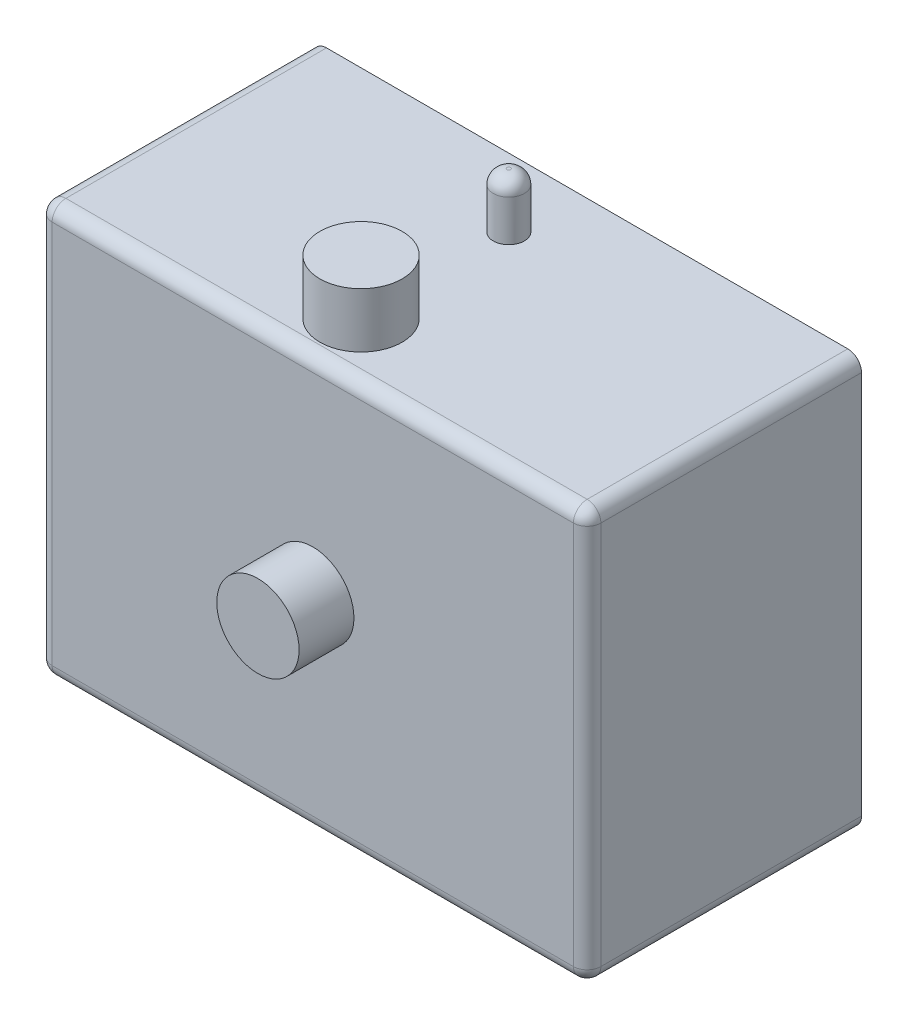
ISO-10303-21;
HEADER;
FILE_DESCRIPTION(('STEP AP214'),'2;1');
FILE_NAME('part.step','',(''),(''),'','','');
FILE_SCHEMA(('AUTOMOTIVE_DESIGN { 1 0 10303 214 1 1 1 1 }'));
ENDSEC;
DATA;
#1=APPLICATION_CONTEXT('core data for automotive mechanical design processes');
#2=APPLICATION_PROTOCOL_DEFINITION('international standard','automotive_design',2000,#1);
#3=PRODUCT_CONTEXT('',#1,'mechanical');
#4=PRODUCT('Part','Part','',(#3));
#5=PRODUCT_RELATED_PRODUCT_CATEGORY('part','',(#4));
#6=PRODUCT_DEFINITION_FORMATION('','',#4);
#7=PRODUCT_DEFINITION_CONTEXT('part definition',#1,'design');
#8=PRODUCT_DEFINITION('design','',#6,#7);
#9=PRODUCT_DEFINITION_SHAPE('','',#8);
#10=(LENGTH_UNIT() NAMED_UNIT(*) SI_UNIT(.MILLI.,.METRE.));
#11=(NAMED_UNIT(*) PLANE_ANGLE_UNIT() SI_UNIT($,.RADIAN.));
#12=(NAMED_UNIT(*) SI_UNIT($,.STERADIAN.) SOLID_ANGLE_UNIT());
#13=UNCERTAINTY_MEASURE_WITH_UNIT(LENGTH_MEASURE(1.E-05),#10,'distance_accuracy_value','');
#14=(GEOMETRIC_REPRESENTATION_CONTEXT(3) GLOBAL_UNCERTAINTY_ASSIGNED_CONTEXT((#13)) GLOBAL_UNIT_ASSIGNED_CONTEXT((#10,
#11,#12)) REPRESENTATION_CONTEXT('',''));
#15=CARTESIAN_POINT('',(0.,0.,0.));
#16=DIRECTION('',(0.,0.,1.));
#17=DIRECTION('',(1.,0.,0.));
#18=AXIS2_PLACEMENT_3D('',#15,#16,#17);
#19=CARTESIAN_POINT('',(-3.28674663438616,95.,79.1242271213655));
#20=DIRECTION('',(0.,-1.,0.));
#21=DIRECTION('',(0.,0.,-1.));
#22=AXIS2_PLACEMENT_3D('',#19,#20,#21);
#23=CYLINDRICAL_SURFACE('',#22,15.);
#24=CARTESIAN_POINT('',(-3.28674663438616,95.,79.1242271213655));
#25=DIRECTION('',(0.,1.,0.));
#26=DIRECTION('',(0.,0.,1.));
#27=AXIS2_PLACEMENT_3D('',#24,#25,#26);
#28=CIRCLE('',#27,15.);
#29=CARTESIAN_POINT('',(-3.28674663438616,95.,94.1242271213655));
#30=VERTEX_POINT('',#29);
#31=EDGE_CURVE('E12',#30,#30,#28,.T.);
#32=ORIENTED_EDGE('',*,*,#31,.F.);
#33=EDGE_LOOP('',(#32));
#34=FACE_BOUND('',#33,.T.);
#35=CARTESIAN_POINT('',(-3.28674663438616,75.,79.1242271213655));
#36=DIRECTION('',(0.,1.,0.));
#37=DIRECTION('',(0.,0.,1.));
#38=AXIS2_PLACEMENT_3D('',#35,#36,#37);
#39=CIRCLE('',#38,15.);
#40=CARTESIAN_POINT('',(-3.28674663438616,75.,94.1242271213655));
#41=VERTEX_POINT('',#40);
#42=EDGE_CURVE('E51',#41,#41,#39,.T.);
#43=ORIENTED_EDGE('',*,*,#42,.T.);
#44=EDGE_LOOP('',(#43));
#45=FACE_BOUND('',#44,.T.);
#46=ADVANCED_FACE('F48',(#34,#45),#23,.T.);
#47=CARTESIAN_POINT('',(-3.28674663438616,95.,79.1242271213655));
#48=DIRECTION('',(0.,1.,0.));
#49=DIRECTION('',(0.,0.,1.));
#50=AXIS2_PLACEMENT_3D('',#47,#48,#49);
#51=PLANE('',#50);
#52=ORIENTED_EDGE('',*,*,#31,.T.);
#53=EDGE_LOOP('',(#52));
#54=FACE_BOUND('',#53,.T.);
#55=ADVANCED_FACE('F63',(#54),#51,.T.);
#56=CARTESIAN_POINT('',(-3.28674663438616,75.,79.1242271213655));
#57=DIRECTION('',(0.,1.,0.));
#58=DIRECTION('',(0.,0.,1.));
#59=AXIS2_PLACEMENT_3D('',#56,#57,#58);
#60=PLANE('',#59);
#61=ORIENTED_EDGE('',*,*,#42,.F.);
#62=EDGE_LOOP('',(#61));
#63=FACE_BOUND('',#62,.T.);
#64=ADVANCED_FACE('F61',(#63),#60,.F.);
#65=CLOSED_SHELL('',(#46,#55,#64));
#66=MANIFOLD_SOLID_BREP('B2',#65);
#67=CARTESIAN_POINT('',(100.,75.,100.));
#68=DIRECTION('',(-1.,0.,0.));
#69=DIRECTION('',(0.,-1.,0.));
#70=AXIS2_PLACEMENT_3D('',#67,#68,#69);
#71=PLANE('',#70);
#72=DIRECTION('',(0.,1.,0.));
#73=VECTOR('',#72,1.);
#74=CARTESIAN_POINT('',(100.,-75.,95.));
#75=LINE('',#74,#73);
#76=CARTESIAN_POINT('',(100.,70.,95.));
#77=VERTEX_POINT('',#76);
#78=CARTESIAN_POINT('',(100.,-70.,95.));
#79=VERTEX_POINT('',#78);
#80=EDGE_CURVE('E332',#77,#79,#75,.F.);
#81=ORIENTED_EDGE('',*,*,#80,.T.);
#82=DIRECTION('',(0.,0.,-1.));
#83=VECTOR('',#82,1.);
#84=CARTESIAN_POINT('',(100.,-70.,100.));
#85=LINE('',#84,#83);
#86=CARTESIAN_POINT('',(100.,-70.,0.));
#87=VERTEX_POINT('',#86);
#88=EDGE_CURVE('E335',#79,#87,#85,.T.);
#89=ORIENTED_EDGE('',*,*,#88,.T.);
#90=DIRECTION('',(0.,1.,0.));
#91=VECTOR('',#90,1.);
#92=CARTESIAN_POINT('',(100.,75.,0.));
#93=LINE('',#92,#91);
#94=CARTESIAN_POINT('',(100.,70.,0.));
#95=VERTEX_POINT('',#94);
#96=EDGE_CURVE('E266',#87,#95,#93,.T.);
#97=ORIENTED_EDGE('',*,*,#96,.T.);
#98=DIRECTION('',(0.,0.,-1.));
#99=VECTOR('',#98,1.);
#100=CARTESIAN_POINT('',(100.,70.,100.));
#101=LINE('',#100,#99);
#102=EDGE_CURVE('E330',#95,#77,#101,.F.);
#103=ORIENTED_EDGE('',*,*,#102,.T.);
#104=EDGE_LOOP('',(#81,#89,#97,#103));
#105=FACE_BOUND('',#104,.T.);
#106=ADVANCED_FACE('F88',(#105),#71,.F.);
#107=CARTESIAN_POINT('',(-100.,75.,100.));
#108=DIRECTION('',(0.,-1.,0.));
#109=DIRECTION('',(0.,0.,-1.));
#110=AXIS2_PLACEMENT_3D('',#107,#108,#109);
#111=PLANE('',#110);
#112=CARTESIAN_POINT('',(-3.65194070487351,75.,24.8929076539954));
#113=DIRECTION('',(0.,-1.,0.));
#114=DIRECTION('',(0.,0.,-1.));
#115=AXIS2_PLACEMENT_3D('',#112,#113,#114);
#116=CIRCLE('',#115,5.67790916202456);
#117=CARTESIAN_POINT('',(-3.65194070487351,75.,19.2149984919709));
#118=VERTEX_POINT('',#117);
#119=EDGE_CURVE('E308',#118,#118,#116,.F.);
#120=ORIENTED_EDGE('',*,*,#119,.F.);
#121=EDGE_LOOP('',(#120));
#122=FACE_BOUND('',#121,.T.);
#123=DIRECTION('',(-1.,0.,0.));
#124=VECTOR('',#123,1.);
#125=CARTESIAN_POINT('',(-100.,75.,0.));
#126=LINE('',#125,#124);
#127=CARTESIAN_POINT('',(95.,75.,0.));
#128=VERTEX_POINT('',#127);
#129=CARTESIAN_POINT('',(-95.,75.,0.));
#130=VERTEX_POINT('',#129);
#131=EDGE_CURVE('E296',#128,#130,#126,.T.);
#132=ORIENTED_EDGE('',*,*,#131,.T.);
#133=DIRECTION('',(0.,0.,-1.));
#134=VECTOR('',#133,1.);
#135=CARTESIAN_POINT('',(-95.,75.,100.));
#136=LINE('',#135,#134);
#137=CARTESIAN_POINT('',(-95.,75.,95.));
#138=VERTEX_POINT('',#137);
#139=EDGE_CURVE('E347',#130,#138,#136,.F.);
#140=ORIENTED_EDGE('',*,*,#139,.T.);
#141=DIRECTION('',(-1.,0.,0.));
#142=VECTOR('',#141,1.);
#143=CARTESIAN_POINT('',(100.,75.,95.));
#144=LINE('',#143,#142);
#145=CARTESIAN_POINT('',(95.,75.,95.));
#146=VERTEX_POINT('',#145);
#147=EDGE_CURVE('E345',#138,#146,#144,.F.);
#148=ORIENTED_EDGE('',*,*,#147,.T.);
#149=DIRECTION('',(0.,0.,-1.));
#150=VECTOR('',#149,1.);
#151=CARTESIAN_POINT('',(95.,75.,100.));
#152=LINE('',#151,#150);
#153=EDGE_CURVE('E343',#146,#128,#152,.T.);
#154=ORIENTED_EDGE('',*,*,#153,.T.);
#155=EDGE_LOOP('',(#132,#140,#148,#154));
#156=FACE_BOUND('',#155,.T.);
#157=ADVANCED_FACE('F430',(#122,#156),#111,.F.);
#158=CARTESIAN_POINT('',(-100.,75.,100.));
#159=DIRECTION('',(1.,0.,0.));
#160=DIRECTION('',(0.,1.,0.));
#161=AXIS2_PLACEMENT_3D('',#158,#159,#160);
#162=PLANE('',#161);
#163=DIRECTION('',(0.,-1.,0.));
#164=VECTOR('',#163,1.);
#165=CARTESIAN_POINT('',(-100.,75.,0.));
#166=LINE('',#165,#164);
#167=CARTESIAN_POINT('',(-100.,70.,0.));
#168=VERTEX_POINT('',#167);
#169=CARTESIAN_POINT('',(-100.,-70.,0.));
#170=VERTEX_POINT('',#169);
#171=EDGE_CURVE('E299',#168,#170,#166,.T.);
#172=ORIENTED_EDGE('',*,*,#171,.T.);
#173=DIRECTION('',(0.,0.,-1.));
#174=VECTOR('',#173,1.);
#175=CARTESIAN_POINT('',(-100.,-70.,100.));
#176=LINE('',#175,#174);
#177=CARTESIAN_POINT('',(-100.,-70.,95.));
#178=VERTEX_POINT('',#177);
#179=EDGE_CURVE('E341',#170,#178,#176,.F.);
#180=ORIENTED_EDGE('',*,*,#179,.T.);
#181=DIRECTION('',(0.,-1.,0.));
#182=VECTOR('',#181,1.);
#183=CARTESIAN_POINT('',(-100.,75.,95.));
#184=LINE('',#183,#182);
#185=CARTESIAN_POINT('',(-100.,70.,95.));
#186=VERTEX_POINT('',#185);
#187=EDGE_CURVE('E339',#178,#186,#184,.F.);
#188=ORIENTED_EDGE('',*,*,#187,.T.);
#189=DIRECTION('',(0.,0.,-1.));
#190=VECTOR('',#189,1.);
#191=CARTESIAN_POINT('',(-100.,70.,100.));
#192=LINE('',#191,#190);
#193=EDGE_CURVE('E337',#186,#168,#192,.T.);
#194=ORIENTED_EDGE('',*,*,#193,.T.);
#195=EDGE_LOOP('',(#172,#180,#188,#194));
#196=FACE_BOUND('',#195,.T.);
#197=ADVANCED_FACE('F416',(#196),#162,.F.);
#198=CARTESIAN_POINT('',(-100.,-75.,100.));
#199=DIRECTION('',(0.,1.,0.));
#200=DIRECTION('',(0.,0.,1.));
#201=AXIS2_PLACEMENT_3D('',#198,#199,#200);
#202=PLANE('',#201);
#203=DIRECTION('',(-1.,0.,0.));
#204=VECTOR('',#203,1.);
#205=CARTESIAN_POINT('',(-100.,-75.,4.03400869781465));
#206=LINE('',#205,#204);
#207=CARTESIAN_POINT('',(76.1429636966117,-75.,4.03400869781465));
#208=VERTEX_POINT('',#207);
#209=CARTESIAN_POINT('',(63.5437682647983,-75.,4.03400869781465));
#210=VERTEX_POINT('',#209);
#211=EDGE_CURVE('E245',#208,#210,#206,.T.);
#212=ORIENTED_EDGE('',*,*,#211,.T.);
#213=CARTESIAN_POINT('',(63.5437682647983,-75.,8.23374050841913));
#214=DIRECTION('',(0.,1.,0.));
#215=DIRECTION('',(0.,0.,1.));
#216=AXIS2_PLACEMENT_3D('',#213,#214,#215);
#217=CIRCLE('',#216,4.19973181060448);
#218=CARTESIAN_POINT('',(63.5437682647983,-75.,12.4334723190236));
#219=VERTEX_POINT('',#218);
#220=EDGE_CURVE('E248',#210,#219,#217,.T.);
#221=ORIENTED_EDGE('',*,*,#220,.T.);
#222=DIRECTION('',(1.,0.,0.));
#223=VECTOR('',#222,1.);
#224=CARTESIAN_POINT('',(-100.,-75.,12.4334723190236));
#225=LINE('',#224,#223);
#226=CARTESIAN_POINT('',(76.1429636966117,-75.,12.4334723190236));
#227=VERTEX_POINT('',#226);
#228=EDGE_CURVE('E240',#219,#227,#225,.T.);
#229=ORIENTED_EDGE('',*,*,#228,.T.);
#230=CARTESIAN_POINT('',(76.1429636966117,-75.,8.23374050841913));
#231=DIRECTION('',(0.,1.,0.));
#232=DIRECTION('',(0.,0.,1.));
#233=AXIS2_PLACEMENT_3D('',#230,#231,#232);
#234=CIRCLE('',#233,4.19973181060448);
#235=EDGE_CURVE('E220',#227,#208,#234,.T.);
#236=ORIENTED_EDGE('',*,*,#235,.T.);
#237=EDGE_LOOP('',(#212,#221,#229,#236));
#238=FACE_BOUND('',#237,.T.);
#239=DIRECTION('',(1.,0.,0.));
#240=VECTOR('',#239,1.);
#241=CARTESIAN_POINT('',(-100.,-75.,0.));
#242=LINE('',#241,#240);
#243=CARTESIAN_POINT('',(-95.,-75.,0.));
#244=VERTEX_POINT('',#243);
#245=CARTESIAN_POINT('',(95.,-75.,0.));
#246=VERTEX_POINT('',#245);
#247=EDGE_CURVE('E302',#244,#246,#242,.T.);
#248=ORIENTED_EDGE('',*,*,#247,.T.);
#249=DIRECTION('',(0.,0.,-1.));
#250=VECTOR('',#249,1.);
#251=CARTESIAN_POINT('',(95.,-75.,100.));
#252=LINE('',#251,#250);
#253=CARTESIAN_POINT('',(95.,-75.,95.));
#254=VERTEX_POINT('',#253);
#255=EDGE_CURVE('E353',#246,#254,#252,.F.);
#256=ORIENTED_EDGE('',*,*,#255,.T.);
#257=DIRECTION('',(1.,0.,0.));
#258=VECTOR('',#257,1.);
#259=CARTESIAN_POINT('',(-100.,-75.,95.));
#260=LINE('',#259,#258);
#261=CARTESIAN_POINT('',(-95.,-75.,95.));
#262=VERTEX_POINT('',#261);
#263=EDGE_CURVE('E351',#254,#262,#260,.F.);
#264=ORIENTED_EDGE('',*,*,#263,.T.);
#265=DIRECTION('',(0.,0.,-1.));
#266=VECTOR('',#265,1.);
#267=CARTESIAN_POINT('',(-95.,-75.,100.));
#268=LINE('',#267,#266);
#269=EDGE_CURVE('E349',#262,#244,#268,.T.);
#270=ORIENTED_EDGE('',*,*,#269,.T.);
#271=EDGE_LOOP('',(#248,#256,#264,#270));
#272=FACE_BOUND('',#271,.T.);
#273=ADVANCED_FACE('F454',(#238,#272),#202,.F.);
#274=CARTESIAN_POINT('',(0.,0.,100.));
#275=DIRECTION('',(0.,0.,1.));
#276=DIRECTION('',(1.,0.,0.));
#277=AXIS2_PLACEMENT_3D('',#274,#275,#276);
#278=PLANE('',#277);
#279=DIRECTION('',(0.,1.,0.));
#280=VECTOR('',#279,1.);
#281=CARTESIAN_POINT('',(95.,75.,100.));
#282=LINE('',#281,#280);
#283=CARTESIAN_POINT('',(95.,-70.,100.));
#284=VERTEX_POINT('',#283);
#285=CARTESIAN_POINT('',(95.,70.,100.));
#286=VERTEX_POINT('',#285);
#287=EDGE_CURVE('E325',#284,#286,#282,.T.);
#288=ORIENTED_EDGE('',*,*,#287,.T.);
#289=DIRECTION('',(-1.,0.,0.));
#290=VECTOR('',#289,1.);
#291=CARTESIAN_POINT('',(-100.,70.,100.));
#292=LINE('',#291,#290);
#293=CARTESIAN_POINT('',(-95.,70.,100.));
#294=VERTEX_POINT('',#293);
#295=EDGE_CURVE('E328',#286,#294,#292,.T.);
#296=ORIENTED_EDGE('',*,*,#295,.T.);
#297=DIRECTION('',(0.,-1.,0.));
#298=VECTOR('',#297,1.);
#299=CARTESIAN_POINT('',(-95.,-75.,100.));
#300=LINE('',#299,#298);
#301=CARTESIAN_POINT('',(-95.,-70.,100.));
#302=VERTEX_POINT('',#301);
#303=EDGE_CURVE('E323',#294,#302,#300,.T.);
#304=ORIENTED_EDGE('',*,*,#303,.T.);
#305=DIRECTION('',(1.,0.,0.));
#306=VECTOR('',#305,1.);
#307=CARTESIAN_POINT('',(100.,-70.,100.));
#308=LINE('',#307,#306);
#309=EDGE_CURVE('E321',#302,#284,#308,.T.);
#310=ORIENTED_EDGE('',*,*,#309,.T.);
#311=EDGE_LOOP('',(#288,#296,#304,#310));
#312=FACE_BOUND('',#311,.T.);
#313=CARTESIAN_POINT('',(0.,0.,100.));
#314=DIRECTION('',(0.,0.,1.));
#315=DIRECTION('',(1.,0.,0.));
#316=AXIS2_PLACEMENT_3D('',#313,#314,#315);
#317=CIRCLE('',#316,15.);
#318=CARTESIAN_POINT('',(15.,0.,100.));
#319=VERTEX_POINT('',#318);
#320=EDGE_CURVE('E260',#319,#319,#317,.T.);
#321=ORIENTED_EDGE('',*,*,#320,.F.);
#322=EDGE_LOOP('',(#321));
#323=FACE_BOUND('',#322,.T.);
#324=ADVANCED_FACE('F405',(#312,#323),#278,.T.);
#325=CARTESIAN_POINT('',(0.,0.,0.));
#326=DIRECTION('',(0.,0.,1.));
#327=DIRECTION('',(1.,0.,0.));
#328=AXIS2_PLACEMENT_3D('',#325,#326,#327);
#329=PLANE('',#328);
#330=DIRECTION('',(1.,0.,0.));
#331=VECTOR('',#330,1.);
#332=CARTESIAN_POINT('',(-100.,-65.,0.));
#333=LINE('',#332,#331);
#334=CARTESIAN_POINT('',(-90.,-65.,0.));
#335=VERTEX_POINT('',#334);
#336=CARTESIAN_POINT('',(90.,-65.,0.));
#337=VERTEX_POINT('',#336);
#338=EDGE_CURVE('E272',#335,#337,#333,.T.);
#339=ORIENTED_EDGE('',*,*,#338,.T.);
#340=DIRECTION('',(0.,1.,0.));
#341=VECTOR('',#340,1.);
#342=CARTESIAN_POINT('',(90.,75.,0.));
#343=LINE('',#342,#341);
#344=CARTESIAN_POINT('',(90.,65.,0.));
#345=VERTEX_POINT('',#344);
#346=EDGE_CURVE('E259',#337,#345,#343,.T.);
#347=ORIENTED_EDGE('',*,*,#346,.T.);
#348=DIRECTION('',(-1.,0.,0.));
#349=VECTOR('',#348,1.);
#350=CARTESIAN_POINT('',(-100.,65.,0.));
#351=LINE('',#350,#349);
#352=CARTESIAN_POINT('',(-90.,65.,0.));
#353=VERTEX_POINT('',#352);
#354=EDGE_CURVE('E286',#345,#353,#351,.T.);
#355=ORIENTED_EDGE('',*,*,#354,.T.);
#356=DIRECTION('',(0.,-1.,0.));
#357=VECTOR('',#356,1.);
#358=CARTESIAN_POINT('',(-90.,75.,0.));
#359=LINE('',#358,#357);
#360=EDGE_CURVE('E289',#353,#335,#359,.T.);
#361=ORIENTED_EDGE('',*,*,#360,.T.);
#362=EDGE_LOOP('',(#339,#347,#355,#361));
#363=FACE_BOUND('',#362,.T.);
#364=ORIENTED_EDGE('',*,*,#96,.F.);
#365=CARTESIAN_POINT('',(95.,-70.,0.));
#366=DIRECTION('',(0.,0.,1.));
#367=DIRECTION('',(1.,0.,0.));
#368=AXIS2_PLACEMENT_3D('',#365,#366,#367);
#369=CIRCLE('',#368,5.);
#370=EDGE_CURVE('E46',#87,#246,#369,.F.);
#371=ORIENTED_EDGE('',*,*,#370,.T.);
#372=ORIENTED_EDGE('',*,*,#247,.F.);
#373=CARTESIAN_POINT('',(-95.,-70.,0.));
#374=DIRECTION('',(0.,0.,1.));
#375=DIRECTION('',(1.,0.,0.));
#376=AXIS2_PLACEMENT_3D('',#373,#374,#375);
#377=CIRCLE('',#376,5.);
#378=EDGE_CURVE('E97',#244,#170,#377,.F.);
#379=ORIENTED_EDGE('',*,*,#378,.T.);
#380=ORIENTED_EDGE('',*,*,#171,.F.);
#381=CARTESIAN_POINT('',(-95.,70.,0.));
#382=DIRECTION('',(0.,0.,1.));
#383=DIRECTION('',(1.,0.,0.));
#384=AXIS2_PLACEMENT_3D('',#381,#382,#383);
#385=CIRCLE('',#384,5.);
#386=EDGE_CURVE('E357',#168,#130,#385,.F.);
#387=ORIENTED_EDGE('',*,*,#386,.T.);
#388=ORIENTED_EDGE('',*,*,#131,.F.);
#389=CARTESIAN_POINT('',(95.,70.,0.));
#390=DIRECTION('',(0.,0.,1.));
#391=DIRECTION('',(1.,0.,0.));
#392=AXIS2_PLACEMENT_3D('',#389,#390,#391);
#393=CIRCLE('',#392,5.);
#394=EDGE_CURVE('E355',#128,#95,#393,.F.);
#395=ORIENTED_EDGE('',*,*,#394,.T.);
#396=EDGE_LOOP('',(#364,#371,#372,#379,#380,#387,#388,#395));
#397=FACE_BOUND('',#396,.T.);
#398=ADVANCED_FACE('F427',(#363,#397),#329,.F.);
#399=CARTESIAN_POINT('',(90.,75.,100.));
#400=DIRECTION('',(-1.,0.,0.));
#401=DIRECTION('',(0.,-1.,0.));
#402=AXIS2_PLACEMENT_3D('',#399,#400,#401);
#403=PLANE('',#402);
#404=ORIENTED_EDGE('',*,*,#346,.F.);
#405=DIRECTION('',(0.,0.,-1.));
#406=VECTOR('',#405,1.);
#407=CARTESIAN_POINT('',(90.,-65.,100.));
#408=LINE('',#407,#406);
#409=CARTESIAN_POINT('',(90.,-65.,90.));
#410=VERTEX_POINT('',#409);
#411=EDGE_CURVE('E273',#410,#337,#408,.T.);
#412=ORIENTED_EDGE('',*,*,#411,.F.);
#413=DIRECTION('',(0.,1.,0.));
#414=VECTOR('',#413,1.);
#415=CARTESIAN_POINT('',(90.,75.,90.));
#416=LINE('',#415,#414);
#417=CARTESIAN_POINT('',(90.,65.,90.));
#418=VERTEX_POINT('',#417);
#419=EDGE_CURVE('E268',#410,#418,#416,.T.);
#420=ORIENTED_EDGE('',*,*,#419,.T.);
#421=DIRECTION('',(0.,0.,-1.));
#422=VECTOR('',#421,1.);
#423=CARTESIAN_POINT('',(90.,65.,100.));
#424=LINE('',#423,#422);
#425=EDGE_CURVE('E263',#418,#345,#424,.T.);
#426=ORIENTED_EDGE('',*,*,#425,.T.);
#427=EDGE_LOOP('',(#404,#412,#420,#426));
#428=FACE_BOUND('',#427,.T.);
#429=ADVANCED_FACE('F695',(#428),#403,.T.);
#430=CARTESIAN_POINT('',(-100.,65.,100.));
#431=DIRECTION('',(0.,-1.,0.));
#432=DIRECTION('',(0.,0.,-1.));
#433=AXIS2_PLACEMENT_3D('',#430,#431,#432);
#434=PLANE('',#433);
#435=CARTESIAN_POINT('',(-3.65194070487351,65.,24.8929076539954));
#436=DIRECTION('',(0.,1.,0.));
#437=DIRECTION('',(0.,0.,1.));
#438=AXIS2_PLACEMENT_3D('',#435,#436,#437);
#439=CIRCLE('',#438,6.12917885444565);
#440=CARTESIAN_POINT('',(-4.10260144774804,65.,18.7803191413753));
#441=VERTEX_POINT('',#440);
#442=EDGE_CURVE('E305',#441,#441,#439,.F.);
#443=ORIENTED_EDGE('',*,*,#442,.F.);
#444=EDGE_LOOP('',(#443));
#445=FACE_BOUND('',#444,.T.);
#446=ORIENTED_EDGE('',*,*,#354,.F.);
#447=ORIENTED_EDGE('',*,*,#425,.F.);
#448=DIRECTION('',(-1.,0.,0.));
#449=VECTOR('',#448,1.);
#450=CARTESIAN_POINT('',(-100.,65.,90.));
#451=LINE('',#450,#449);
#452=CARTESIAN_POINT('',(-90.,65.,90.));
#453=VERTEX_POINT('',#452);
#454=EDGE_CURVE('E271',#418,#453,#451,.T.);
#455=ORIENTED_EDGE('',*,*,#454,.T.);
#456=DIRECTION('',(0.,0.,-1.));
#457=VECTOR('',#456,1.);
#458=CARTESIAN_POINT('',(-90.,65.,100.));
#459=LINE('',#458,#457);
#460=EDGE_CURVE('E267',#453,#353,#459,.T.);
#461=ORIENTED_EDGE('',*,*,#460,.T.);
#462=EDGE_LOOP('',(#446,#447,#455,#461));
#463=FACE_BOUND('',#462,.T.);
#464=ADVANCED_FACE('F686',(#445,#463),#434,.T.);
#465=CARTESIAN_POINT('',(-90.,75.,100.));
#466=DIRECTION('',(1.,0.,0.));
#467=DIRECTION('',(0.,1.,0.));
#468=AXIS2_PLACEMENT_3D('',#465,#466,#467);
#469=PLANE('',#468);
#470=ORIENTED_EDGE('',*,*,#360,.F.);
#471=ORIENTED_EDGE('',*,*,#460,.F.);
#472=DIRECTION('',(0.,-1.,0.));
#473=VECTOR('',#472,1.);
#474=CARTESIAN_POINT('',(-90.,75.,90.));
#475=LINE('',#474,#473);
#476=CARTESIAN_POINT('',(-90.,-65.,90.));
#477=VERTEX_POINT('',#476);
#478=EDGE_CURVE('E280',#453,#477,#475,.T.);
#479=ORIENTED_EDGE('',*,*,#478,.T.);
#480=DIRECTION('',(0.,0.,-1.));
#481=VECTOR('',#480,1.);
#482=CARTESIAN_POINT('',(-90.,-65.,100.));
#483=LINE('',#482,#481);
#484=EDGE_CURVE('E275',#477,#335,#483,.T.);
#485=ORIENTED_EDGE('',*,*,#484,.T.);
#486=EDGE_LOOP('',(#470,#471,#479,#485));
#487=FACE_BOUND('',#486,.T.);
#488=ADVANCED_FACE('F679',(#487),#469,.T.);
#489=CARTESIAN_POINT('',(-100.,-65.,100.));
#490=DIRECTION('',(0.,1.,0.));
#491=DIRECTION('',(0.,0.,1.));
#492=AXIS2_PLACEMENT_3D('',#489,#490,#491);
#493=PLANE('',#492);
#494=CARTESIAN_POINT('',(63.5437682647983,-65.,8.23374050841913));
#495=DIRECTION('',(0.,1.,0.));
#496=DIRECTION('',(0.,0.,1.));
#497=AXIS2_PLACEMENT_3D('',#494,#495,#496);
#498=CIRCLE('',#497,4.19973181060448);
#499=CARTESIAN_POINT('',(63.5437682647983,-65.,4.03400869781465));
#500=VERTEX_POINT('',#499);
#501=CARTESIAN_POINT('',(63.5437682647983,-65.,12.4334723190236));
#502=VERTEX_POINT('',#501);
#503=EDGE_CURVE('E113',#500,#502,#498,.T.);
#504=ORIENTED_EDGE('',*,*,#503,.F.);
#505=DIRECTION('',(-1.,0.,0.));
#506=VECTOR('',#505,1.);
#507=CARTESIAN_POINT('',(63.5437682647983,-65.,4.03400869781465));
#508=LINE('',#507,#506);
#509=CARTESIAN_POINT('',(76.1429636966117,-65.,4.03400869781465));
#510=VERTEX_POINT('',#509);
#511=EDGE_CURVE('E233',#510,#500,#508,.T.);
#512=ORIENTED_EDGE('',*,*,#511,.F.);
#513=CARTESIAN_POINT('',(76.1429636966117,-65.,8.23374050841913));
#514=DIRECTION('',(0.,1.,0.));
#515=DIRECTION('',(0.,0.,1.));
#516=AXIS2_PLACEMENT_3D('',#513,#514,#515);
#517=CIRCLE('',#516,4.19973181060448);
#518=CARTESIAN_POINT('',(76.1429636966117,-65.,12.4334723190236));
#519=VERTEX_POINT('',#518);
#520=EDGE_CURVE('E217',#519,#510,#517,.T.);
#521=ORIENTED_EDGE('',*,*,#520,.F.);
#522=DIRECTION('',(1.,0.,0.));
#523=VECTOR('',#522,1.);
#524=CARTESIAN_POINT('',(63.5437682647983,-65.,12.4334723190236));
#525=LINE('',#524,#523);
#526=EDGE_CURVE('E226',#502,#519,#525,.T.);
#527=ORIENTED_EDGE('',*,*,#526,.F.);
#528=EDGE_LOOP('',(#504,#512,#521,#527));
#529=FACE_BOUND('',#528,.T.);
#530=CARTESIAN_POINT('',(-3.65194070487351,-65.,24.8929076539954));
#531=DIRECTION('',(0.,1.,0.));
#532=DIRECTION('',(0.,0.,1.));
#533=AXIS2_PLACEMENT_3D('',#530,#531,#532);
#534=CIRCLE('',#533,10.);
#535=CARTESIAN_POINT('',(-3.65194070487351,-65.,34.8929076539954));
#536=VERTEX_POINT('',#535);
#537=EDGE_CURVE('E252',#536,#536,#534,.T.);
#538=ORIENTED_EDGE('',*,*,#537,.F.);
#539=EDGE_LOOP('',(#538));
#540=FACE_BOUND('',#539,.T.);
#541=ORIENTED_EDGE('',*,*,#338,.F.);
#542=ORIENTED_EDGE('',*,*,#484,.F.);
#543=DIRECTION('',(1.,0.,0.));
#544=VECTOR('',#543,1.);
#545=CARTESIAN_POINT('',(-100.,-65.,90.));
#546=LINE('',#545,#544);
#547=EDGE_CURVE('E276',#477,#410,#546,.T.);
#548=ORIENTED_EDGE('',*,*,#547,.T.);
#549=ORIENTED_EDGE('',*,*,#411,.T.);
#550=EDGE_LOOP('',(#541,#542,#548,#549));
#551=FACE_BOUND('',#550,.T.);
#552=ADVANCED_FACE('F230',(#529,#540,#551),#493,.T.);
#553=CARTESIAN_POINT('',(0.,0.,90.));
#554=DIRECTION('',(0.,0.,1.));
#555=DIRECTION('',(1.,0.,0.));
#556=AXIS2_PLACEMENT_3D('',#553,#554,#555);
#557=PLANE('',#556);
#558=ORIENTED_EDGE('',*,*,#419,.F.);
#559=ORIENTED_EDGE('',*,*,#547,.F.);
#560=ORIENTED_EDGE('',*,*,#478,.F.);
#561=ORIENTED_EDGE('',*,*,#454,.F.);
#562=EDGE_LOOP('',(#558,#559,#560,#561));
#563=FACE_BOUND('',#562,.T.);
#564=ADVANCED_FACE('F662',(#563),#557,.F.);
#565=CARTESIAN_POINT('',(0.,0.,120.));
#566=DIRECTION('',(0.,0.,-1.));
#567=DIRECTION('',(-1.,0.,0.));
#568=AXIS2_PLACEMENT_3D('',#565,#566,#567);
#569=CYLINDRICAL_SURFACE('',#568,15.);
#570=CARTESIAN_POINT('',(0.,0.,120.));
#571=DIRECTION('',(0.,0.,1.));
#572=DIRECTION('',(1.,0.,0.));
#573=AXIS2_PLACEMENT_3D('',#570,#571,#572);
#574=CIRCLE('',#573,15.);
#575=CARTESIAN_POINT('',(15.,0.,120.));
#576=VERTEX_POINT('',#575);
#577=EDGE_CURVE('E256',#576,#576,#574,.T.);
#578=ORIENTED_EDGE('',*,*,#577,.F.);
#579=EDGE_LOOP('',(#578));
#580=FACE_BOUND('',#579,.T.);
#581=ORIENTED_EDGE('',*,*,#320,.T.);
#582=EDGE_LOOP('',(#581));
#583=FACE_BOUND('',#582,.T.);
#584=ADVANCED_FACE('F653',(#580,#583),#569,.T.);
#585=CARTESIAN_POINT('',(0.,0.,120.));
#586=DIRECTION('',(0.,0.,1.));
#587=DIRECTION('',(1.,0.,0.));
#588=AXIS2_PLACEMENT_3D('',#585,#586,#587);
#589=PLANE('',#588);
#590=ORIENTED_EDGE('',*,*,#577,.T.);
#591=EDGE_LOOP('',(#590));
#592=FACE_BOUND('',#591,.T.);
#593=ADVANCED_FACE('F643',(#592),#589,.T.);
#594=CARTESIAN_POINT('',(-3.65194070487351,-15.,24.8929076539954));
#595=DIRECTION('',(0.,-1.,0.));
#596=DIRECTION('',(0.,0.,-1.));
#597=AXIS2_PLACEMENT_3D('',#594,#595,#596);
#598=CYLINDRICAL_SURFACE('',#597,10.);
#599=CARTESIAN_POINT('',(-3.65194070487351,-15.,24.8929076539954));
#600=DIRECTION('',(0.,-1.,0.));
#601=DIRECTION('',(0.,0.,-1.));
#602=AXIS2_PLACEMENT_3D('',#599,#600,#601);
#603=CIRCLE('',#602,10.);
#604=CARTESIAN_POINT('',(-6.42374571009973,-15.,15.284729001774));
#605=VERTEX_POINT('',#604);
#606=EDGE_CURVE('E255',#605,#605,#603,.F.);
#607=ORIENTED_EDGE('',*,*,#606,.F.);
#608=EDGE_LOOP('',(#607));
#609=FACE_BOUND('',#608,.T.);
#610=ORIENTED_EDGE('',*,*,#537,.T.);
#611=EDGE_LOOP('',(#610));
#612=FACE_BOUND('',#611,.T.);
#613=ADVANCED_FACE('F634',(#609,#612),#598,.T.);
#614=CARTESIAN_POINT('',(-6.42374571009973,-15.,15.284729001774));
#615=CARTESIAN_POINT('',(-3.81245841495407,75.,19.2172679088255));
#616=CARTESIAN_POINT('',(-25.6401030145425,-15.,20.8283390122265));
#617=CARTESIAN_POINT('',(-15.163737905294,75.,19.5383033289866));
#618=CARTESIAN_POINT('',(-20.0964930040901,-15.,40.0446963166693));
#619=CARTESIAN_POINT('',(-14.8427024851329,75.,30.8895828193265));
#620=CARTESIAN_POINT('',(-0.880135699647295,-15.,34.5010863062168));
#621=CARTESIAN_POINT('',(-3.49142299479295,75.,30.5685473991654));
#622=CARTESIAN_POINT('',(18.3362216047955,-15.,28.9574762957644));
#623=CARTESIAN_POINT('',(7.85985649554697,75.,30.2475119790043));
#624=CARTESIAN_POINT('',(12.7926115943431,-15.,9.74111899132161));
#625=CARTESIAN_POINT('',(7.53882107538584,75.,18.8962324886644));
#626=CARTESIAN_POINT('',(-6.42374571009973,-15.,15.284729001774));
#627=CARTESIAN_POINT('',(-3.81245841495407,75.,19.2172679088255));
#628=(BOUNDED_SURFACE() B_SPLINE_SURFACE(3,1,((#614,#615),(#616,#617),(#618,#619),(#620,#621),
(#622,#623),(#624,#625),(#626,#627)),.UNSPECIFIED.,.T.,.F.,.F.) B_SPLINE_SURFACE_WITH_KNOTS((4,
3,4),(2,2),(0.,0.5,1.),(0.,1.),
.UNSPECIFIED.) GEOMETRIC_REPRESENTATION_ITEM() RATIONAL_B_SPLINE_SURFACE(((1.,1.),
(0.333333333333333,0.333333333333333),(0.333333333333333,0.333333333333333),(1.,1.),
(0.333333333333333,0.333333333333333),(0.333333333333333,0.333333333333333),(1.,1.))) REPRESENTATION_ITEM('') SURFACE());
#629=CARTESIAN_POINT('',(-4.10260144774804,65.,18.7803191413753));
#630=CARTESIAN_POINT('',(-4.1267800338142,64.1666666666667,18.7439067440878));
#631=CARTESIAN_POINT('',(-4.15095861988036,63.3333333333333,18.7074943468003));
#632=CARTESIAN_POINT('',(-4.19931579201269,61.6666666666667,18.6346695522253));
#633=CARTESIAN_POINT('',(-4.22349437807885,60.8333333333333,18.5982571549377));
#634=CARTESIAN_POINT('',(-4.27185155021118,59.1666666666667,18.5254323603627));
#635=CARTESIAN_POINT('',(-4.29603013627734,58.3333333333333,18.4890199630752));
#636=CARTESIAN_POINT('',(-4.34438730840967,56.6666666666667,18.4161951685002));
#637=CARTESIAN_POINT('',(-4.36856589447583,55.8333333333333,18.3797827712127));
#638=CARTESIAN_POINT('',(-4.41692306660816,54.1666666666667,18.3069579766376));
#639=CARTESIAN_POINT('',(-4.44110165267432,53.3333333333333,18.2705455793501));
#640=CARTESIAN_POINT('',(-4.48945882480665,51.6666666666667,18.1977207847751));
#641=CARTESIAN_POINT('',(-4.51363741087281,50.8333333333333,18.1613083874876));
#642=CARTESIAN_POINT('',(-4.56199458300514,49.1666666666667,18.0884835929126));
#643=CARTESIAN_POINT('',(-4.5861731690713,48.3333333333333,18.0520711956251));
#644=CARTESIAN_POINT('',(-4.63453034120363,46.6666666666667,17.97924640105));
#645=CARTESIAN_POINT('',(-4.6587089272698,45.8333333333333,17.9428340037625));
#646=CARTESIAN_POINT('',(-4.70706609940212,44.1666666666667,17.8700092091875));
#647=CARTESIAN_POINT('',(-4.73124468546829,43.3333333333333,17.8335968119));
#648=CARTESIAN_POINT('',(-4.77960185760061,41.6666666666667,17.7607720173249));
#649=CARTESIAN_POINT('',(-4.80378044366678,40.8333333333333,17.7243596200374));
#650=CARTESIAN_POINT('',(-4.8521376157991,39.1666666666667,17.6515348254624));
#651=CARTESIAN_POINT('',(-4.87631620186527,38.3333333333333,17.6151224281749));
#652=CARTESIAN_POINT('',(-4.92467337399759,36.6666666666667,17.5422976335999));
#653=CARTESIAN_POINT('',(-4.94885196006376,35.8333333333333,17.5058852363124));
#654=CARTESIAN_POINT('',(-4.99720913219608,34.1666666666667,17.4330604417373));
#655=CARTESIAN_POINT('',(-5.02138771826225,33.3333333333333,17.3966480444498));
#656=CARTESIAN_POINT('',(-5.06974489039457,31.6666666666667,17.3238232498748));
#657=CARTESIAN_POINT('',(-5.09392347646074,30.8333333333333,17.2874108525873));
#658=CARTESIAN_POINT('',(-5.14228064859306,29.1666666666667,17.2145860580122));
#659=CARTESIAN_POINT('',(-5.16645923465923,28.3333333333333,17.1781736607247));
#660=CARTESIAN_POINT('',(-5.21481640679155,26.6666666666667,17.1053488661497));
#661=CARTESIAN_POINT('',(-5.23899499285772,25.8333333333333,17.0689364688622));
#662=CARTESIAN_POINT('',(-5.28735216499004,24.1666666666667,16.9961116742872));
#663=CARTESIAN_POINT('',(-5.31153075105621,23.3333333333333,16.9596992769997));
#664=CARTESIAN_POINT('',(-5.35988792318853,21.6666666666667,16.8868744824246));
#665=CARTESIAN_POINT('',(-5.3840665092547,20.8333333333333,16.8504620851371));
#666=CARTESIAN_POINT('',(-5.43242368138702,19.1666666666667,16.7776372905621));
#667=CARTESIAN_POINT('',(-5.45660226745319,18.3333333333333,16.7412248932746));
#668=CARTESIAN_POINT('',(-5.50495943958551,16.6666666666667,16.6684000986995));
#669=CARTESIAN_POINT('',(-5.52913802565168,15.8333333333333,16.631987701412));
#670=CARTESIAN_POINT('',(-5.57749519778401,14.1666666666667,16.559162906837));
#671=CARTESIAN_POINT('',(-5.60167378385017,13.3333333333333,16.5227505095495));
#672=CARTESIAN_POINT('',(-5.6500309559825,11.6666666666667,16.4499257149745));
#673=CARTESIAN_POINT('',(-5.67420954204866,10.8333333333333,16.413513317687));
#674=CARTESIAN_POINT('',(-5.72256671418099,9.16666666666667,16.3406885231119));
#675=CARTESIAN_POINT('',(-5.74674530024715,8.33333333333333,16.3042761258244));
#676=CARTESIAN_POINT('',(-5.79510247237948,6.66666666666667,16.2314513312494));
#677=CARTESIAN_POINT('',(-5.81928105844564,5.83333333333333,16.1950389339619));
#678=CARTESIAN_POINT('',(-5.86763823057797,4.16666666666667,16.1222141393868));
#679=CARTESIAN_POINT('',(-5.89181681664413,3.33333333333333,16.0858017420993));
#680=CARTESIAN_POINT('',(-5.94017398877646,1.66666666666666,16.0129769475243));
#681=CARTESIAN_POINT('',(-5.96435257484262,0.83333333333333,15.9765645502368));
#682=CARTESIAN_POINT('',(-6.01270974697495,-0.833333333333337,15.9037397556618));
#683=CARTESIAN_POINT('',(-6.03688833304111,-1.66666666666667,15.8673273583743));
#684=CARTESIAN_POINT('',(-6.08524550517344,-3.33333333333333,15.7945025637992));
#685=CARTESIAN_POINT('',(-6.1094240912396,-4.16666666666667,15.7580901665117));
#686=CARTESIAN_POINT('',(-6.15778126337193,-5.83333333333333,15.6852653719367));
#687=CARTESIAN_POINT('',(-6.18195984943809,-6.66666666666666,15.6488529746492));
#688=CARTESIAN_POINT('',(-6.23031702157042,-8.33333333333333,15.5760281800741));
#689=CARTESIAN_POINT('',(-6.25449560763658,-9.16666666666666,15.5396157827866));
#690=CARTESIAN_POINT('',(-6.30285277976891,-10.8333333333333,15.4667909882116));
#691=CARTESIAN_POINT('',(-6.32703136583507,-11.6666666666667,15.4303785909241));
#692=CARTESIAN_POINT('',(-6.3753885379674,-13.3333333333333,15.3575537963491));
#693=CARTESIAN_POINT('',(-6.39956712403356,-14.1666666666667,15.3211413990616));
#694=CARTESIAN_POINT('',(-6.42374571009973,-15.,15.284729001774));
#695=B_SPLINE_CURVE_WITH_KNOTS('',3,(#629,#630,#631,#632,#633,#634,#635,#636,#637,#638,#639,
#640,#641,#642,#643,#644,#645,#646,#647,#648,#649,#650,#651,#652,#653,#654,#655,#656,#657,#658,
#659,#660,#661,#662,#663,#664,#665,#666,#667,#668,#669,#670,#671,#672,#673,#674,#675,#676,#677,
#678,#679,#680,#681,#682,#683,#684,#685,#686,#687,#688,#689,#690,#691,#692,#693,#694),
.UNSPECIFIED.,.F.,.F.,(4,2,2,2,2,2,2,2,2,2,2,2,2,2,2,2,2,2,2,2,2,2,2,2,2,2,2,2,2,2,2,2,4),(0.,
2.50343647818424,5.00687295636846,7.51030943455269,10.0137459127369,12.5171823909211,
15.0206188691054,17.5240553472896,20.0274918254738,22.530928303658,25.0343647818423,
27.5378012600265,30.0412377382107,32.544674216395,35.0481106945792,37.5515471727634,
40.0549836509476,42.5584201291319,45.0618566073161,47.5652930855003,50.0687295636845,
52.5721660418688,55.075602520053,57.5790389982372,60.0824754764214,62.5859119546057,
65.0893484327899,67.5927849109741,70.0962213891583,72.5996578673426,75.1030943455268,
77.606530823711,80.1099673018952),.UNSPECIFIED.);
#696=EDGE_CURVE('BSEAM625',#441,#605,#695,.T.);
#697=ORIENTED_EDGE('',*,*,#442,.T.);
#698=ORIENTED_EDGE('',*,*,#606,.T.);
#699=ORIENTED_EDGE('',*,*,#696,.T.);
#700=ORIENTED_EDGE('',*,*,#696,.F.);
#701=EDGE_LOOP('',(#697,#699,#698,#700));
#702=FACE_BOUND('',#701,.T.);
#703=ADVANCED_FACE('F625',(#702),#628,.T.);
#704=CARTESIAN_POINT('',(-3.65194070487351,95.,24.8929076539954));
#705=DIRECTION('',(0.,-1.,0.));
#706=DIRECTION('',(0.,0.,-1.));
#707=AXIS2_PLACEMENT_3D('',#704,#705,#706);
#708=CYLINDRICAL_SURFACE('',#707,5.67790916202456);
#709=CARTESIAN_POINT('',(-3.65194070487351,90.,24.8929076539954));
#710=DIRECTION('',(0.,1.,0.));
#711=DIRECTION('',(0.,0.,1.));
#712=AXIS2_PLACEMENT_3D('',#709,#710,#711);
#713=CIRCLE('',#712,5.67790916202456);
#714=CARTESIAN_POINT('',(-3.65194070487351,90.,30.57081681602));
#715=VERTEX_POINT('',#714);
#716=EDGE_CURVE('E318',#715,#715,#713,.F.);
#717=ORIENTED_EDGE('',*,*,#716,.T.);
#718=EDGE_LOOP('',(#717));
#719=FACE_BOUND('',#718,.T.);
#720=ORIENTED_EDGE('',*,*,#119,.T.);
#721=EDGE_LOOP('',(#720));
#722=FACE_BOUND('',#721,.T.);
#723=ADVANCED_FACE('F616',(#719,#722),#708,.T.);
#724=CARTESIAN_POINT('',(-3.65194070487351,95.,24.8929076539954));
#725=DIRECTION('',(0.,1.,0.));
#726=DIRECTION('',(0.,0.,1.));
#727=AXIS2_PLACEMENT_3D('',#724,#725,#726);
#728=PLANE('',#727);
#729=CARTESIAN_POINT('',(-3.65194070487351,95.,24.8929076539954));
#730=DIRECTION('',(0.,1.,0.));
#731=DIRECTION('',(0.,0.,1.));
#732=AXIS2_PLACEMENT_3D('',#729,#730,#731);
#733=CIRCLE('',#732,0.67790916202456);
#734=CARTESIAN_POINT('',(-3.65194070487351,95.,25.57081681602));
#735=VERTEX_POINT('',#734);
#736=EDGE_CURVE('E315',#735,#735,#733,.T.);
#737=ORIENTED_EDGE('',*,*,#736,.T.);
#738=EDGE_LOOP('',(#737));
#739=FACE_BOUND('',#738,.T.);
#740=ADVANCED_FACE('F462',(#739),#728,.T.);
#741=CARTESIAN_POINT('',(-3.65194070487351,90.,24.8929076539954));
#742=DIRECTION('',(0.,1.,0.));
#743=DIRECTION('',(0.,0.,1.));
#744=AXIS2_PLACEMENT_3D('',#741,#742,#743);
#745=DEGENERATE_TOROIDAL_SURFACE('',#744,0.67790916202456,5.,.T.);
#746=ORIENTED_EDGE('',*,*,#716,.F.);
#747=EDGE_LOOP('',(#746));
#748=FACE_BOUND('',#747,.T.);
#749=ORIENTED_EDGE('',*,*,#736,.F.);
#750=EDGE_LOOP('',(#749));
#751=FACE_BOUND('',#750,.T.);
#752=ADVANCED_FACE('F457',(#748,#751),#745,.T.);
#753=CARTESIAN_POINT('',(-95.,-70.,100.));
#754=DIRECTION('',(0.,0.,-1.));
#755=DIRECTION('',(-1.,0.,0.));
#756=AXIS2_PLACEMENT_3D('',#753,#754,#755);
#757=CYLINDRICAL_SURFACE('',#756,5.);
#758=ORIENTED_EDGE('',*,*,#378,.F.);
#759=ORIENTED_EDGE('',*,*,#269,.F.);
#760=CARTESIAN_POINT('',(-95.,-70.,95.));
#761=DIRECTION('',(0.,0.,1.));
#762=DIRECTION('',(1.,0.,0.));
#763=AXIS2_PLACEMENT_3D('',#760,#761,#762);
#764=CIRCLE('',#763,5.);
#765=EDGE_CURVE('E92',#178,#262,#764,.T.);
#766=ORIENTED_EDGE('',*,*,#765,.F.);
#767=ORIENTED_EDGE('',*,*,#179,.F.);
#768=EDGE_LOOP('',(#758,#759,#766,#767));
#769=FACE_BOUND('',#768,.T.);
#770=ADVANCED_FACE('F90',(#769),#757,.T.);
#771=CARTESIAN_POINT('',(-95.,0.,95.));
#772=DIRECTION('',(0.,1.,0.));
#773=DIRECTION('',(-1.,0.,0.));
#774=AXIS2_PLACEMENT_3D('',#771,#772,#773);
#775=CYLINDRICAL_SURFACE('',#774,5.);
#776=CARTESIAN_POINT('',(-95.,70.,95.));
#777=DIRECTION('',(0.,1.,0.));
#778=DIRECTION('',(0.,0.,1.));
#779=AXIS2_PLACEMENT_3D('',#776,#777,#778);
#780=CIRCLE('',#779,5.);
#781=EDGE_CURVE('E384',#186,#294,#780,.T.);
#782=ORIENTED_EDGE('',*,*,#781,.F.);
#783=ORIENTED_EDGE('',*,*,#187,.F.);
#784=CARTESIAN_POINT('',(-95.,-70.,95.));
#785=DIRECTION('',(0.,-1.,0.));
#786=DIRECTION('',(0.,0.,-1.));
#787=AXIS2_PLACEMENT_3D('',#784,#785,#786);
#788=CIRCLE('',#787,5.);
#789=EDGE_CURVE('E386',#302,#178,#788,.T.);
#790=ORIENTED_EDGE('',*,*,#789,.F.);
#791=ORIENTED_EDGE('',*,*,#303,.F.);
#792=EDGE_LOOP('',(#782,#783,#790,#791));
#793=FACE_BOUND('',#792,.T.);
#794=ADVANCED_FACE('F413',(#793),#775,.T.);
#795=CARTESIAN_POINT('',(-95.,70.,100.));
#796=DIRECTION('',(0.,0.,-1.));
#797=DIRECTION('',(-1.,0.,0.));
#798=AXIS2_PLACEMENT_3D('',#795,#796,#797);
#799=CYLINDRICAL_SURFACE('',#798,5.);
#800=ORIENTED_EDGE('',*,*,#386,.F.);
#801=ORIENTED_EDGE('',*,*,#193,.F.);
#802=CARTESIAN_POINT('',(-95.,70.,95.));
#803=DIRECTION('',(0.,0.,1.));
#804=DIRECTION('',(1.,0.,0.));
#805=AXIS2_PLACEMENT_3D('',#802,#803,#804);
#806=CIRCLE('',#805,5.);
#807=EDGE_CURVE('E381',#138,#186,#806,.T.);
#808=ORIENTED_EDGE('',*,*,#807,.F.);
#809=ORIENTED_EDGE('',*,*,#139,.F.);
#810=EDGE_LOOP('',(#800,#801,#808,#809));
#811=FACE_BOUND('',#810,.T.);
#812=ADVANCED_FACE('F421',(#811),#799,.T.);
#813=CARTESIAN_POINT('',(-95.,-70.,95.));
#814=DIRECTION('',(-1.,0.,0.));
#815=DIRECTION('',(0.,0.,1.));
#816=AXIS2_PLACEMENT_3D('',#813,#814,#815);
#817=SPHERICAL_SURFACE('',#816,5.);
#818=ORIENTED_EDGE('',*,*,#789,.T.);
#819=ORIENTED_EDGE('',*,*,#765,.T.);
#820=CARTESIAN_POINT('',(-95.,-70.,95.));
#821=DIRECTION('',(-1.,0.,0.));
#822=DIRECTION('',(0.,0.,1.));
#823=AXIS2_PLACEMENT_3D('',#820,#821,#822);
#824=CIRCLE('',#823,5.);
#825=EDGE_CURVE('E378',#302,#262,#824,.F.);
#826=ORIENTED_EDGE('',*,*,#825,.F.);
#827=EDGE_LOOP('',(#818,#819,#826));
#828=FACE_BOUND('',#827,.T.);
#829=ADVANCED_FACE('F393',(#828),#817,.T.);
#830=CARTESIAN_POINT('',(-95.,70.,95.));
#831=DIRECTION('',(-1.,0.,0.));
#832=DIRECTION('',(0.,0.,1.));
#833=AXIS2_PLACEMENT_3D('',#830,#831,#832);
#834=SPHERICAL_SURFACE('',#833,5.);
#835=ORIENTED_EDGE('',*,*,#807,.T.);
#836=ORIENTED_EDGE('',*,*,#781,.T.);
#837=CARTESIAN_POINT('',(-95.,70.,95.));
#838=DIRECTION('',(-1.,0.,0.));
#839=DIRECTION('',(0.,0.,1.));
#840=AXIS2_PLACEMENT_3D('',#837,#838,#839);
#841=CIRCLE('',#840,5.);
#842=EDGE_CURVE('E375',#138,#294,#841,.F.);
#843=ORIENTED_EDGE('',*,*,#842,.F.);
#844=EDGE_LOOP('',(#835,#836,#843));
#845=FACE_BOUND('',#844,.T.);
#846=ADVANCED_FACE('F491',(#845),#834,.T.);
#847=CARTESIAN_POINT('',(95.,-70.,100.));
#848=DIRECTION('',(0.,0.,-1.));
#849=DIRECTION('',(-1.,0.,0.));
#850=AXIS2_PLACEMENT_3D('',#847,#848,#849);
#851=CYLINDRICAL_SURFACE('',#850,5.);
#852=ORIENTED_EDGE('',*,*,#370,.F.);
#853=ORIENTED_EDGE('',*,*,#88,.F.);
#854=CARTESIAN_POINT('',(95.,-70.,95.));
#855=DIRECTION('',(0.,0.,1.));
#856=DIRECTION('',(1.,0.,0.));
#857=AXIS2_PLACEMENT_3D('',#854,#855,#856);
#858=CIRCLE('',#857,5.);
#859=EDGE_CURVE('E372',#254,#79,#858,.T.);
#860=ORIENTED_EDGE('',*,*,#859,.F.);
#861=ORIENTED_EDGE('',*,*,#255,.F.);
#862=EDGE_LOOP('',(#852,#853,#860,#861));
#863=FACE_BOUND('',#862,.T.);
#864=ADVANCED_FACE('F452',(#863),#851,.T.);
#865=CARTESIAN_POINT('',(0.,-70.,95.));
#866=DIRECTION('',(-1.,0.,0.));
#867=DIRECTION('',(0.,0.,1.));
#868=AXIS2_PLACEMENT_3D('',#865,#866,#867);
#869=CYLINDRICAL_SURFACE('',#868,5.);
#870=ORIENTED_EDGE('',*,*,#825,.T.);
#871=ORIENTED_EDGE('',*,*,#263,.F.);
#872=CARTESIAN_POINT('',(95.,-70.,95.));
#873=DIRECTION('',(1.,0.,0.));
#874=DIRECTION('',(0.,0.,-1.));
#875=AXIS2_PLACEMENT_3D('',#872,#873,#874);
#876=CIRCLE('',#875,5.);
#877=EDGE_CURVE('E369',#284,#254,#876,.T.);
#878=ORIENTED_EDGE('',*,*,#877,.F.);
#879=ORIENTED_EDGE('',*,*,#309,.F.);
#880=EDGE_LOOP('',(#870,#871,#878,#879));
#881=FACE_BOUND('',#880,.T.);
#882=ADVANCED_FACE('F400',(#881),#869,.T.);
#883=CARTESIAN_POINT('',(0.,70.,95.));
#884=DIRECTION('',(1.,0.,0.));
#885=DIRECTION('',(0.,0.,-1.));
#886=AXIS2_PLACEMENT_3D('',#883,#884,#885);
#887=CYLINDRICAL_SURFACE('',#886,5.);
#888=ORIENTED_EDGE('',*,*,#842,.T.);
#889=ORIENTED_EDGE('',*,*,#295,.F.);
#890=CARTESIAN_POINT('',(95.,70.,95.));
#891=DIRECTION('',(1.,0.,0.));
#892=DIRECTION('',(0.,0.,-1.));
#893=AXIS2_PLACEMENT_3D('',#890,#891,#892);
#894=CIRCLE('',#893,5.);
#895=EDGE_CURVE('E366',#146,#286,#894,.T.);
#896=ORIENTED_EDGE('',*,*,#895,.F.);
#897=ORIENTED_EDGE('',*,*,#147,.F.);
#898=EDGE_LOOP('',(#888,#889,#896,#897));
#899=FACE_BOUND('',#898,.T.);
#900=ADVANCED_FACE('F440',(#899),#887,.T.);
#901=CARTESIAN_POINT('',(95.,70.,100.));
#902=DIRECTION('',(0.,0.,-1.));
#903=DIRECTION('',(-1.,0.,0.));
#904=AXIS2_PLACEMENT_3D('',#901,#902,#903);
#905=CYLINDRICAL_SURFACE('',#904,5.);
#906=ORIENTED_EDGE('',*,*,#394,.F.);
#907=ORIENTED_EDGE('',*,*,#153,.F.);
#908=CARTESIAN_POINT('',(95.,70.,95.));
#909=DIRECTION('',(0.,0.,1.));
#910=DIRECTION('',(1.,0.,0.));
#911=AXIS2_PLACEMENT_3D('',#908,#909,#910);
#912=CIRCLE('',#911,5.);
#913=EDGE_CURVE('E363',#77,#146,#912,.T.);
#914=ORIENTED_EDGE('',*,*,#913,.F.);
#915=ORIENTED_EDGE('',*,*,#102,.F.);
#916=EDGE_LOOP('',(#906,#907,#914,#915));
#917=FACE_BOUND('',#916,.T.);
#918=ADVANCED_FACE('F436',(#917),#905,.T.);
#919=CARTESIAN_POINT('',(95.,-70.,95.));
#920=DIRECTION('',(0.,-1.,0.));
#921=DIRECTION('',(0.,0.,-1.));
#922=AXIS2_PLACEMENT_3D('',#919,#920,#921);
#923=SPHERICAL_SURFACE('',#922,5.);
#924=ORIENTED_EDGE('',*,*,#877,.T.);
#925=ORIENTED_EDGE('',*,*,#859,.T.);
#926=CARTESIAN_POINT('',(95.,-70.,95.));
#927=DIRECTION('',(0.,-1.,0.));
#928=DIRECTION('',(0.,0.,-1.));
#929=AXIS2_PLACEMENT_3D('',#926,#927,#928);
#930=CIRCLE('',#929,5.);
#931=EDGE_CURVE('E361',#284,#79,#930,.F.);
#932=ORIENTED_EDGE('',*,*,#931,.F.);
#933=EDGE_LOOP('',(#924,#925,#932));
#934=FACE_BOUND('',#933,.T.);
#935=ADVANCED_FACE('F479',(#934),#923,.T.);
#936=CARTESIAN_POINT('',(95.,70.,95.));
#937=DIRECTION('',(0.,1.,0.));
#938=DIRECTION('',(0.,0.,1.));
#939=AXIS2_PLACEMENT_3D('',#936,#937,#938);
#940=SPHERICAL_SURFACE('',#939,5.);
#941=ORIENTED_EDGE('',*,*,#913,.T.);
#942=ORIENTED_EDGE('',*,*,#895,.T.);
#943=CARTESIAN_POINT('',(95.,70.,95.));
#944=DIRECTION('',(0.,1.,0.));
#945=DIRECTION('',(0.,0.,1.));
#946=AXIS2_PLACEMENT_3D('',#943,#944,#945);
#947=CIRCLE('',#946,5.);
#948=EDGE_CURVE('E251',#77,#286,#947,.F.);
#949=ORIENTED_EDGE('',*,*,#948,.F.);
#950=EDGE_LOOP('',(#941,#942,#949));
#951=FACE_BOUND('',#950,.T.);
#952=ADVANCED_FACE('F443',(#951),#940,.T.);
#953=CARTESIAN_POINT('',(95.,0.,95.));
#954=DIRECTION('',(0.,-1.,0.));
#955=DIRECTION('',(1.,0.,0.));
#956=AXIS2_PLACEMENT_3D('',#953,#954,#955);
#957=CYLINDRICAL_SURFACE('',#956,5.);
#958=ORIENTED_EDGE('',*,*,#931,.T.);
#959=ORIENTED_EDGE('',*,*,#80,.F.);
#960=ORIENTED_EDGE('',*,*,#948,.T.);
#961=ORIENTED_EDGE('',*,*,#287,.F.);
#962=EDGE_LOOP('',(#958,#959,#960,#961));
#963=FACE_BOUND('',#962,.T.);
#964=ADVANCED_FACE('F445',(#963),#957,.T.);
#965=CARTESIAN_POINT('',(63.5437682647983,-85.,8.23374050841913));
#966=DIRECTION('',(0.,1.,0.));
#967=DIRECTION('',(0.,0.,1.));
#968=AXIS2_PLACEMENT_3D('',#965,#966,#967);
#969=CYLINDRICAL_SURFACE('',#968,4.19973181060448);
#970=DIRECTION('',(0.,1.,0.));
#971=VECTOR('',#970,1.);
#972=CARTESIAN_POINT('',(63.5437682647983,-85.,4.03400869781465));
#973=LINE('',#972,#971);
#974=EDGE_CURVE('E238',#210,#500,#973,.T.);
#975=ORIENTED_EDGE('',*,*,#974,.T.);
#976=ORIENTED_EDGE('',*,*,#503,.T.);
#977=DIRECTION('',(0.,1.,0.));
#978=VECTOR('',#977,1.);
#979=CARTESIAN_POINT('',(63.5437682647983,-85.,12.4334723190236));
#980=LINE('',#979,#978);
#981=EDGE_CURVE('E223',#219,#502,#980,.T.);
#982=ORIENTED_EDGE('',*,*,#981,.F.);
#983=ORIENTED_EDGE('',*,*,#220,.F.);
#984=EDGE_LOOP('',(#975,#976,#982,#983));
#985=FACE_BOUND('',#984,.T.);
#986=ADVANCED_FACE('F476',(#985),#969,.F.);
#987=CARTESIAN_POINT('',(63.5437682647983,-85.,4.03400869781465));
#988=DIRECTION('',(0.,0.,-1.));
#989=DIRECTION('',(-1.,0.,0.));
#990=AXIS2_PLACEMENT_3D('',#987,#988,#989);
#991=PLANE('',#990);
#992=DIRECTION('',(0.,1.,0.));
#993=VECTOR('',#992,1.);
#994=CARTESIAN_POINT('',(76.1429636966117,-85.,4.03400869781465));
#995=LINE('',#994,#993);
#996=EDGE_CURVE('E222',#208,#510,#995,.T.);
#997=ORIENTED_EDGE('',*,*,#996,.T.);
#998=ORIENTED_EDGE('',*,*,#511,.T.);
#999=ORIENTED_EDGE('',*,*,#974,.F.);
#1000=ORIENTED_EDGE('',*,*,#211,.F.);
#1001=EDGE_LOOP('',(#997,#998,#999,#1000));
#1002=FACE_BOUND('',#1001,.T.);
#1003=ADVANCED_FACE('F545',(#1002),#991,.F.);
#1004=CARTESIAN_POINT('',(76.1429636966117,-85.,8.23374050841913));
#1005=DIRECTION('',(0.,1.,0.));
#1006=DIRECTION('',(0.,0.,1.));
#1007=AXIS2_PLACEMENT_3D('',#1004,#1005,#1006);
#1008=CYLINDRICAL_SURFACE('',#1007,4.19973181060448);
#1009=DIRECTION('',(0.,1.,0.));
#1010=VECTOR('',#1009,1.);
#1011=CARTESIAN_POINT('',(76.1429636966117,-85.,12.4334723190236));
#1012=LINE('',#1011,#1010);
#1013=EDGE_CURVE('E105',#227,#519,#1012,.T.);
#1014=ORIENTED_EDGE('',*,*,#1013,.T.);
#1015=ORIENTED_EDGE('',*,*,#520,.T.);
#1016=ORIENTED_EDGE('',*,*,#996,.F.);
#1017=ORIENTED_EDGE('',*,*,#235,.F.);
#1018=EDGE_LOOP('',(#1014,#1015,#1016,#1017));
#1019=FACE_BOUND('',#1018,.T.);
#1020=ADVANCED_FACE('F214',(#1019),#1008,.F.);
#1021=CARTESIAN_POINT('',(63.5437682647983,-85.,12.4334723190236));
#1022=DIRECTION('',(0.,0.,1.));
#1023=DIRECTION('',(1.,0.,0.));
#1024=AXIS2_PLACEMENT_3D('',#1021,#1022,#1023);
#1025=PLANE('',#1024);
#1026=ORIENTED_EDGE('',*,*,#981,.T.);
#1027=ORIENTED_EDGE('',*,*,#526,.T.);
#1028=ORIENTED_EDGE('',*,*,#1013,.F.);
#1029=ORIENTED_EDGE('',*,*,#228,.F.);
#1030=EDGE_LOOP('',(#1026,#1027,#1028,#1029));
#1031=FACE_BOUND('',#1030,.T.);
#1032=ADVANCED_FACE('F227',(#1031),#1025,.F.);
#1033=CLOSED_SHELL('',(#106,#157,#197,#273,#324,#398,#429,#464,#488,#552,#564,#584,#593,#613,
#703,#723,#740,#752,#770,#794,#812,#829,#846,#864,#882,#900,#918,#935,#952,#964,#986,#1003,
#1020,#1032));
#1034=MANIFOLD_SOLID_BREP('B7',#1033);
#1035=ADVANCED_BREP_SHAPE_REPRESENTATION('',(#18,#66,#1034),#14);
#1036=SHAPE_DEFINITION_REPRESENTATION(#9,#1035);
ENDSEC;
END-ISO-10303-21;
